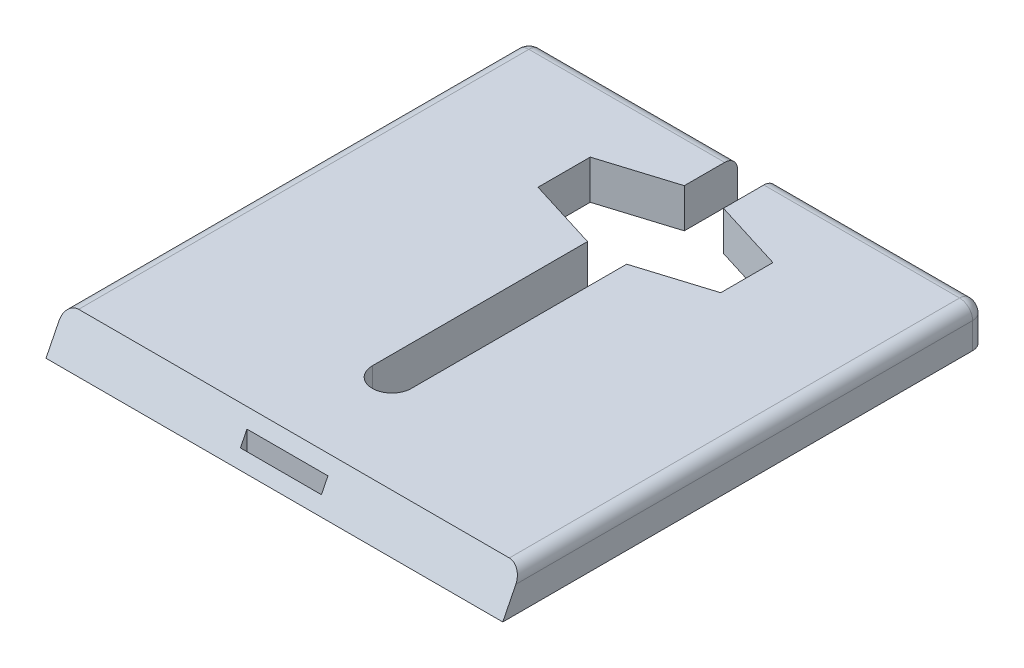
ISO-10303-21;
HEADER;
FILE_DESCRIPTION(('STEP AP214'),'2;1');
FILE_NAME('part.step','',(''),(''),'','','');
FILE_SCHEMA(('AUTOMOTIVE_DESIGN { 1 0 10303 214 1 1 1 1 }'));
ENDSEC;
DATA;
#1=APPLICATION_CONTEXT('core data for automotive mechanical design processes');
#2=APPLICATION_PROTOCOL_DEFINITION('international standard','automotive_design',2000,#1);
#3=PRODUCT_CONTEXT('',#1,'mechanical');
#4=PRODUCT('Part','Part','',(#3));
#5=PRODUCT_RELATED_PRODUCT_CATEGORY('part','',(#4));
#6=PRODUCT_DEFINITION_FORMATION('','',#4);
#7=PRODUCT_DEFINITION_CONTEXT('part definition',#1,'design');
#8=PRODUCT_DEFINITION('design','',#6,#7);
#9=PRODUCT_DEFINITION_SHAPE('','',#8);
#10=(LENGTH_UNIT() NAMED_UNIT(*) SI_UNIT(.MILLI.,.METRE.));
#11=(NAMED_UNIT(*) PLANE_ANGLE_UNIT() SI_UNIT($,.RADIAN.));
#12=(NAMED_UNIT(*) SI_UNIT($,.STERADIAN.) SOLID_ANGLE_UNIT());
#13=UNCERTAINTY_MEASURE_WITH_UNIT(LENGTH_MEASURE(1.E-05),#10,'distance_accuracy_value','');
#14=(GEOMETRIC_REPRESENTATION_CONTEXT(3) GLOBAL_UNCERTAINTY_ASSIGNED_CONTEXT((#13)) GLOBAL_UNIT_ASSIGNED_CONTEXT((#10,
#11,#12)) REPRESENTATION_CONTEXT('',''));
#15=CARTESIAN_POINT('',(0.,0.,0.));
#16=DIRECTION('',(0.,0.,1.));
#17=DIRECTION('',(1.,0.,0.));
#18=AXIS2_PLACEMENT_3D('',#15,#16,#17);
#19=CARTESIAN_POINT('',(-8.75,1.5,-9.25));
#20=DIRECTION('',(0.,0.,1.));
#21=DIRECTION('',(1.,0.,0.));
#22=AXIS2_PLACEMENT_3D('',#19,#20,#21);
#23=PLANE('',#22);
#24=DIRECTION('',(-1.,0.,0.));
#25=VECTOR('',#24,1.);
#26=CARTESIAN_POINT('',(-8.75,0.,-9.25));
#27=LINE('',#26,#25);
#28=CARTESIAN_POINT('',(8.25,0.,-9.25));
#29=VERTEX_POINT('',#28);
#30=CARTESIAN_POINT('',(0.75,0.,-9.25));
#31=VERTEX_POINT('',#30);
#32=EDGE_CURVE('E348',#29,#31,#27,.T.);
#33=ORIENTED_EDGE('',*,*,#32,.T.);
#34=DIRECTION('',(0.,1.,0.));
#35=VECTOR('',#34,1.);
#36=CARTESIAN_POINT('',(0.75,-15.5724115023974,-9.25));
#37=LINE('',#36,#35);
#38=CARTESIAN_POINT('',(0.75,0.999999999999999,-9.25));
#39=VERTEX_POINT('',#38);
#40=EDGE_CURVE('E233',#31,#39,#37,.T.);
#41=ORIENTED_EDGE('',*,*,#40,.T.);
#42=DIRECTION('',(-1.,0.,0.));
#43=VECTOR('',#42,1.);
#44=CARTESIAN_POINT('',(-8.75,1.,-9.25));
#45=LINE('',#44,#43);
#46=CARTESIAN_POINT('',(8.25,1.,-9.25));
#47=VERTEX_POINT('',#46);
#48=EDGE_CURVE('E373',#39,#47,#45,.F.);
#49=ORIENTED_EDGE('',*,*,#48,.T.);
#50=DIRECTION('',(0.,-1.,0.));
#51=VECTOR('',#50,1.);
#52=CARTESIAN_POINT('',(8.25,1.5,-9.25));
#53=LINE('',#52,#51);
#54=EDGE_CURVE('E403',#47,#29,#53,.T.);
#55=ORIENTED_EDGE('',*,*,#54,.T.);
#56=EDGE_LOOP('',(#33,#41,#49,#55));
#57=FACE_BOUND('',#56,.T.);
#58=ADVANCED_FACE('F40',(#57),#23,.F.);
#59=CARTESIAN_POINT('',(0.,1.,-8.75));
#60=DIRECTION('',(-1.,0.,0.));
#61=DIRECTION('',(0.,0.,1.));
#62=AXIS2_PLACEMENT_3D('',#59,#60,#61);
#63=CYLINDRICAL_SURFACE('',#62,0.5);
#64=CARTESIAN_POINT('',(-0.75,1.,-8.75));
#65=DIRECTION('',(-1.,0.,0.));
#66=DIRECTION('',(0.,0.,1.));
#67=AXIS2_PLACEMENT_3D('',#64,#65,#66);
#68=CIRCLE('',#67,0.5);
#69=CARTESIAN_POINT('',(-0.75,0.999999999999999,-9.25));
#70=VERTEX_POINT('',#69);
#71=CARTESIAN_POINT('',(-0.75,1.5,-8.75));
#72=VERTEX_POINT('',#71);
#73=EDGE_CURVE('E268',#70,#72,#68,.F.);
#74=ORIENTED_EDGE('',*,*,#73,.F.);
#75=CARTESIAN_POINT('',(-8.25,1.,-9.25));
#76=VERTEX_POINT('',#75);
#77=EDGE_CURVE('E374',#76,#70,#45,.F.);
#78=ORIENTED_EDGE('',*,*,#77,.F.);
#79=CARTESIAN_POINT('',(-8.25,1.,-8.75));
#80=DIRECTION('',(-1.,0.,0.));
#81=DIRECTION('',(0.,0.,1.));
#82=AXIS2_PLACEMENT_3D('',#79,#80,#81);
#83=CIRCLE('',#82,0.5);
#84=CARTESIAN_POINT('',(-8.25,1.5,-8.75));
#85=VERTEX_POINT('',#84);
#86=EDGE_CURVE('E389',#76,#85,#83,.F.);
#87=ORIENTED_EDGE('',*,*,#86,.T.);
#88=DIRECTION('',(-1.,0.,0.));
#89=VECTOR('',#88,1.);
#90=CARTESIAN_POINT('',(0.,1.5,-8.75));
#91=LINE('',#90,#89);
#92=EDGE_CURVE('E361',#72,#85,#91,.T.);
#93=ORIENTED_EDGE('',*,*,#92,.F.);
#94=EDGE_LOOP('',(#74,#78,#87,#93));
#95=FACE_BOUND('',#94,.T.);
#96=ADVANCED_FACE('F460',(#95),#63,.T.);
#97=CARTESIAN_POINT('',(8.75,1.5,9.25));
#98=DIRECTION('',(-1.,0.,0.));
#99=DIRECTION('',(0.,0.,1.));
#100=AXIS2_PLACEMENT_3D('',#97,#98,#99);
#101=PLANE('',#100);
#102=DIRECTION('',(0.,0.,-1.));
#103=VECTOR('',#102,1.);
#104=CARTESIAN_POINT('',(8.75,0.,9.25));
#105=LINE('',#104,#103);
#106=CARTESIAN_POINT('',(8.75,0.,9.25));
#107=VERTEX_POINT('',#106);
#108=CARTESIAN_POINT('',(8.75,0.,-8.75));
#109=VERTEX_POINT('',#108);
#110=EDGE_CURVE('E343',#107,#109,#105,.T.);
#111=ORIENTED_EDGE('',*,*,#110,.T.);
#112=DIRECTION('',(0.,-1.,0.));
#113=VECTOR('',#112,1.);
#114=CARTESIAN_POINT('',(8.75,1.5,-8.75));
#115=LINE('',#114,#113);
#116=CARTESIAN_POINT('',(8.75,1.,-8.75));
#117=VERTEX_POINT('',#116);
#118=EDGE_CURVE('E413',#109,#117,#115,.F.);
#119=ORIENTED_EDGE('',*,*,#118,.T.);
#120=DIRECTION('',(0.,0.,-1.));
#121=VECTOR('',#120,1.);
#122=CARTESIAN_POINT('',(8.75,1.,9.25));
#123=LINE('',#122,#121);
#124=CARTESIAN_POINT('',(8.75,1.,8.75));
#125=VERTEX_POINT('',#124);
#126=EDGE_CURVE('E370',#117,#125,#123,.F.);
#127=ORIENTED_EDGE('',*,*,#126,.T.);
#128=DIRECTION('',(0.,0.894427190999916,-0.447213595499958));
#129=VECTOR('',#128,1.);
#130=CARTESIAN_POINT('',(8.75,0.,9.25));
#131=LINE('',#130,#129);
#132=EDGE_CURVE('E328',#107,#125,#131,.T.);
#133=ORIENTED_EDGE('',*,*,#132,.F.);
#134=EDGE_LOOP('',(#111,#119,#127,#133));
#135=FACE_BOUND('',#134,.T.);
#136=ADVANCED_FACE('F467',(#135),#101,.F.);
#137=ORIENTED_EDGE('',*,*,#77,.T.);
#138=DIRECTION('',(0.,1.,0.));
#139=VECTOR('',#138,1.);
#140=CARTESIAN_POINT('',(-0.75,-15.5724115023974,-9.25));
#141=LINE('',#140,#139);
#142=CARTESIAN_POINT('',(-0.75,0.,-9.25));
#143=VERTEX_POINT('',#142);
#144=EDGE_CURVE('E252',#143,#70,#141,.T.);
#145=ORIENTED_EDGE('',*,*,#144,.F.);
#146=CARTESIAN_POINT('',(-8.25,0.,-9.25));
#147=VERTEX_POINT('',#146);
#148=EDGE_CURVE('E347',#143,#147,#27,.T.);
#149=ORIENTED_EDGE('',*,*,#148,.T.);
#150=DIRECTION('',(0.,-1.,0.));
#151=VECTOR('',#150,1.);
#152=CARTESIAN_POINT('',(-8.25,1.5,-9.25));
#153=LINE('',#152,#151);
#154=EDGE_CURVE('E400',#147,#76,#153,.F.);
#155=ORIENTED_EDGE('',*,*,#154,.T.);
#156=EDGE_LOOP('',(#137,#145,#149,#155));
#157=FACE_BOUND('',#156,.T.);
#158=ADVANCED_FACE('F463',(#157),#23,.F.);
#159=CARTESIAN_POINT('',(-8.75,1.5,9.25));
#160=DIRECTION('',(1.,0.,0.));
#161=DIRECTION('',(0.,0.,-1.));
#162=AXIS2_PLACEMENT_3D('',#159,#160,#161);
#163=PLANE('',#162);
#164=DIRECTION('',(0.,0.,1.));
#165=VECTOR('',#164,1.);
#166=CARTESIAN_POINT('',(-8.75,1.,9.25));
#167=LINE('',#166,#165);
#168=CARTESIAN_POINT('',(-8.75,1.,8.75));
#169=VERTEX_POINT('',#168);
#170=CARTESIAN_POINT('',(-8.75,1.,-8.75));
#171=VERTEX_POINT('',#170);
#172=EDGE_CURVE('E378',#169,#171,#167,.F.);
#173=ORIENTED_EDGE('',*,*,#172,.T.);
#174=DIRECTION('',(0.,-1.,0.));
#175=VECTOR('',#174,1.);
#176=CARTESIAN_POINT('',(-8.75,1.5,-8.75));
#177=LINE('',#176,#175);
#178=CARTESIAN_POINT('',(-8.75,0.,-8.75));
#179=VERTEX_POINT('',#178);
#180=EDGE_CURVE('E416',#171,#179,#177,.T.);
#181=ORIENTED_EDGE('',*,*,#180,.T.);
#182=DIRECTION('',(0.,0.,1.));
#183=VECTOR('',#182,1.);
#184=CARTESIAN_POINT('',(-8.75,0.,9.25));
#185=LINE('',#184,#183);
#186=CARTESIAN_POINT('',(-8.75,0.,9.25));
#187=VERTEX_POINT('',#186);
#188=EDGE_CURVE('E351',#179,#187,#185,.T.);
#189=ORIENTED_EDGE('',*,*,#188,.T.);
#190=DIRECTION('',(0.,-0.894427190999916,0.447213595499958));
#191=VECTOR('',#190,1.);
#192=CARTESIAN_POINT('',(-8.75,0.,9.25));
#193=LINE('',#192,#191);
#194=EDGE_CURVE('E334',#169,#187,#193,.T.);
#195=ORIENTED_EDGE('',*,*,#194,.F.);
#196=EDGE_LOOP('',(#173,#181,#189,#195));
#197=FACE_BOUND('',#196,.T.);
#198=ADVANCED_FACE('F474',(#197),#163,.F.);
#199=CARTESIAN_POINT('',(0.,1.5,0.));
#200=DIRECTION('',(0.,-1.,0.));
#201=DIRECTION('',(0.,0.,-1.));
#202=AXIS2_PLACEMENT_3D('',#199,#200,#201);
#203=PLANE('',#202);
#204=DIRECTION('',(0.,0.,-1.));
#205=VECTOR('',#204,1.);
#206=CARTESIAN_POINT('',(0.75,1.5,-9.25));
#207=LINE('',#206,#205);
#208=CARTESIAN_POINT('',(0.75,1.5,-7.20404962177391));
#209=VERTEX_POINT('',#208);
#210=CARTESIAN_POINT('',(0.75,1.5,-8.75));
#211=VERTEX_POINT('',#210);
#212=EDGE_CURVE('E527',#209,#211,#207,.T.);
#213=ORIENTED_EDGE('',*,*,#212,.F.);
#214=DIRECTION('',(-0.955005001561926,0.,-0.29658969468224));
#215=VECTOR('',#214,1.);
#216=CARTESIAN_POINT('',(0.75,1.5,-7.20404962177391));
#217=LINE('',#216,#215);
#218=CARTESIAN_POINT('',(3.5,1.5,-6.35));
#219=VERTEX_POINT('',#218);
#220=EDGE_CURVE('E210',#219,#209,#217,.T.);
#221=ORIENTED_EDGE('',*,*,#220,.F.);
#222=DIRECTION('',(0.,0.,-1.));
#223=VECTOR('',#222,1.);
#224=CARTESIAN_POINT('',(3.5,1.5,0.));
#225=LINE('',#224,#223);
#226=CARTESIAN_POINT('',(3.5,1.5,-4.35));
#227=VERTEX_POINT('',#226);
#228=EDGE_CURVE('E306',#227,#219,#225,.T.);
#229=ORIENTED_EDGE('',*,*,#228,.F.);
#230=DIRECTION('',(0.955005001561926,0.,-0.296589694682241));
#231=VECTOR('',#230,1.);
#232=CARTESIAN_POINT('',(3.5,1.5,-4.35));
#233=LINE('',#232,#231);
#234=CARTESIAN_POINT('',(0.750000000000001,1.5,-3.49595037822608));
#235=VERTEX_POINT('',#234);
#236=EDGE_CURVE('E229',#235,#227,#233,.T.);
#237=ORIENTED_EDGE('',*,*,#236,.F.);
#238=CARTESIAN_POINT('',(0.750000000000002,1.5,4.75));
#239=VERTEX_POINT('',#238);
#240=EDGE_CURVE('E540',#239,#235,#207,.T.);
#241=ORIENTED_EDGE('',*,*,#240,.F.);
#242=CARTESIAN_POINT('',(0.,1.5,4.75));
#243=DIRECTION('',(0.,1.,0.));
#244=DIRECTION('',(0.,0.,1.));
#245=AXIS2_PLACEMENT_3D('',#242,#243,#244);
#246=CIRCLE('',#245,0.75);
#247=CARTESIAN_POINT('',(-0.749999999999998,1.5,4.75));
#248=VERTEX_POINT('',#247);
#249=EDGE_CURVE('E550',#248,#239,#246,.T.);
#250=ORIENTED_EDGE('',*,*,#249,.F.);
#251=DIRECTION('',(0.,0.,1.));
#252=VECTOR('',#251,1.);
#253=CARTESIAN_POINT('',(-0.75,1.5,-9.25));
#254=LINE('',#253,#252);
#255=CARTESIAN_POINT('',(-0.749999999999999,1.5,-3.49595037822608));
#256=VERTEX_POINT('',#255);
#257=EDGE_CURVE('E557',#256,#248,#254,.T.);
#258=ORIENTED_EDGE('',*,*,#257,.F.);
#259=DIRECTION('',(0.955005001561927,0.,0.29658969468224));
#260=VECTOR('',#259,1.);
#261=CARTESIAN_POINT('',(-0.749999999999999,1.5,-3.49595037822608));
#262=LINE('',#261,#260);
#263=CARTESIAN_POINT('',(-3.5,1.5,-4.35));
#264=VERTEX_POINT('',#263);
#265=EDGE_CURVE('E576',#264,#256,#262,.T.);
#266=ORIENTED_EDGE('',*,*,#265,.F.);
#267=DIRECTION('',(0.,0.,-1.));
#268=VECTOR('',#267,1.);
#269=CARTESIAN_POINT('',(-3.5,1.5,0.));
#270=LINE('',#269,#268);
#271=CARTESIAN_POINT('',(-3.5,1.5,-6.35));
#272=VERTEX_POINT('',#271);
#273=EDGE_CURVE('E300',#264,#272,#270,.T.);
#274=ORIENTED_EDGE('',*,*,#273,.T.);
#275=DIRECTION('',(-0.955005001561927,0.,0.296589694682241));
#276=VECTOR('',#275,1.);
#277=CARTESIAN_POINT('',(-3.5,1.5,-6.35));
#278=LINE('',#277,#276);
#279=CARTESIAN_POINT('',(-0.75,1.5,-7.20404962177391));
#280=VERTEX_POINT('',#279);
#281=EDGE_CURVE('E573',#280,#272,#278,.T.);
#282=ORIENTED_EDGE('',*,*,#281,.F.);
#283=EDGE_CURVE('E556',#72,#280,#254,.T.);
#284=ORIENTED_EDGE('',*,*,#283,.F.);
#285=ORIENTED_EDGE('',*,*,#92,.T.);
#286=DIRECTION('',(0.,0.,1.));
#287=VECTOR('',#286,1.);
#288=CARTESIAN_POINT('',(-8.25,1.5,0.));
#289=LINE('',#288,#287);
#290=CARTESIAN_POINT('',(-8.25,1.5,8.5));
#291=VERTEX_POINT('',#290);
#292=EDGE_CURVE('E357',#85,#291,#289,.T.);
#293=ORIENTED_EDGE('',*,*,#292,.T.);
#294=DIRECTION('',(-1.,0.,0.));
#295=VECTOR('',#294,1.);
#296=CARTESIAN_POINT('',(10.4270509831248,1.5,8.5));
#297=LINE('',#296,#295);
#298=CARTESIAN_POINT('',(8.25,1.5,8.5));
#299=VERTEX_POINT('',#298);
#300=EDGE_CURVE('E333',#299,#291,#297,.T.);
#301=ORIENTED_EDGE('',*,*,#300,.F.);
#302=DIRECTION('',(0.,0.,-1.));
#303=VECTOR('',#302,1.);
#304=CARTESIAN_POINT('',(8.25,1.5,0.));
#305=LINE('',#304,#303);
#306=CARTESIAN_POINT('',(8.25,1.5,-8.75));
#307=VERTEX_POINT('',#306);
#308=EDGE_CURVE('E366',#299,#307,#305,.T.);
#309=ORIENTED_EDGE('',*,*,#308,.T.);
#310=EDGE_CURVE('E362',#307,#211,#91,.T.);
#311=ORIENTED_EDGE('',*,*,#310,.T.);
#312=EDGE_LOOP('',(#213,#221,#229,#237,#241,#250,#258,#266,#274,#282,#284,#285,#293,#301,#309,#311));
#313=FACE_BOUND('',#312,.T.);
#314=ADVANCED_FACE('F480',(#313),#203,.F.);
#315=CARTESIAN_POINT('',(0.,0.,0.));
#316=DIRECTION('',(0.,-1.,0.));
#317=DIRECTION('',(0.,0.,-1.));
#318=AXIS2_PLACEMENT_3D('',#315,#316,#317);
#319=PLANE('',#318);
#320=DIRECTION('',(-0.955005001561927,0.,-0.29658969468224));
#321=VECTOR('',#320,1.);
#322=CARTESIAN_POINT('',(0.75,0.,-7.20404962177391));
#323=LINE('',#322,#321);
#324=CARTESIAN_POINT('',(3.5,0.,-6.35));
#325=VERTEX_POINT('',#324);
#326=CARTESIAN_POINT('',(0.75,0.,-7.20404962177391));
#327=VERTEX_POINT('',#326);
#328=EDGE_CURVE('E207',#325,#327,#323,.T.);
#329=ORIENTED_EDGE('',*,*,#328,.T.);
#330=DIRECTION('',(0.,0.,-1.));
#331=VECTOR('',#330,1.);
#332=CARTESIAN_POINT('',(0.75,0.,-9.25));
#333=LINE('',#332,#331);
#334=EDGE_CURVE('E222',#327,#31,#333,.T.);
#335=ORIENTED_EDGE('',*,*,#334,.T.);
#336=ORIENTED_EDGE('',*,*,#32,.F.);
#337=CARTESIAN_POINT('',(8.25,0.,-8.75));
#338=DIRECTION('',(0.,-1.,0.));
#339=DIRECTION('',(0.,0.,-1.));
#340=AXIS2_PLACEMENT_3D('',#337,#338,#339);
#341=CIRCLE('',#340,0.5);
#342=EDGE_CURVE('E410',#29,#109,#341,.T.);
#343=ORIENTED_EDGE('',*,*,#342,.T.);
#344=ORIENTED_EDGE('',*,*,#110,.F.);
#345=DIRECTION('',(1.,0.,0.));
#346=VECTOR('',#345,1.);
#347=CARTESIAN_POINT('',(-8.75,0.,9.25));
#348=LINE('',#347,#346);
#349=EDGE_CURVE('E354',#187,#107,#348,.T.);
#350=ORIENTED_EDGE('',*,*,#349,.F.);
#351=ORIENTED_EDGE('',*,*,#188,.F.);
#352=CARTESIAN_POINT('',(-8.25,0.,-8.75));
#353=DIRECTION('',(0.,-1.,0.));
#354=DIRECTION('',(0.,0.,-1.));
#355=AXIS2_PLACEMENT_3D('',#352,#353,#354);
#356=CIRCLE('',#355,0.5);
#357=EDGE_CURVE('E406',#179,#147,#356,.T.);
#358=ORIENTED_EDGE('',*,*,#357,.T.);
#359=ORIENTED_EDGE('',*,*,#148,.F.);
#360=DIRECTION('',(0.,0.,1.));
#361=VECTOR('',#360,1.);
#362=CARTESIAN_POINT('',(-0.75,0.,-9.25));
#363=LINE('',#362,#361);
#364=CARTESIAN_POINT('',(-0.75,0.,-7.20404962177391));
#365=VERTEX_POINT('',#364);
#366=EDGE_CURVE('E245',#143,#365,#363,.T.);
#367=ORIENTED_EDGE('',*,*,#366,.T.);
#368=DIRECTION('',(-0.955005001561927,0.,0.29658969468224));
#369=VECTOR('',#368,1.);
#370=CARTESIAN_POINT('',(-3.5,0.,-6.35));
#371=LINE('',#370,#369);
#372=CARTESIAN_POINT('',(-3.5,0.,-6.35));
#373=VERTEX_POINT('',#372);
#374=EDGE_CURVE('E228',#365,#373,#371,.T.);
#375=ORIENTED_EDGE('',*,*,#374,.T.);
#376=DIRECTION('',(0.,0.,-1.));
#377=VECTOR('',#376,1.);
#378=CARTESIAN_POINT('',(-3.5,0.,0.));
#379=LINE('',#378,#377);
#380=CARTESIAN_POINT('',(-3.5,0.,-4.35));
#381=VERTEX_POINT('',#380);
#382=EDGE_CURVE('E299',#381,#373,#379,.T.);
#383=ORIENTED_EDGE('',*,*,#382,.F.);
#384=DIRECTION('',(0.955005001561927,0.,0.29658969468224));
#385=VECTOR('',#384,1.);
#386=CARTESIAN_POINT('',(-0.749999999999999,0.,-3.49595037822608));
#387=LINE('',#386,#385);
#388=CARTESIAN_POINT('',(-0.749999999999999,0.,-3.49595037822608));
#389=VERTEX_POINT('',#388);
#390=EDGE_CURVE('E567',#381,#389,#387,.T.);
#391=ORIENTED_EDGE('',*,*,#390,.T.);
#392=CARTESIAN_POINT('',(-0.749999999999998,0.,4.75));
#393=VERTEX_POINT('',#392);
#394=EDGE_CURVE('E537',#389,#393,#363,.T.);
#395=ORIENTED_EDGE('',*,*,#394,.T.);
#396=CARTESIAN_POINT('',(0.,0.,4.75));
#397=DIRECTION('',(0.,-1.,0.));
#398=DIRECTION('',(0.,0.,-1.));
#399=AXIS2_PLACEMENT_3D('',#396,#397,#398);
#400=CIRCLE('',#399,0.75);
#401=CARTESIAN_POINT('',(0.750000000000002,0.,4.75));
#402=VERTEX_POINT('',#401);
#403=EDGE_CURVE('E241',#393,#402,#400,.F.);
#404=ORIENTED_EDGE('',*,*,#403,.T.);
#405=CARTESIAN_POINT('',(0.750000000000001,0.,-3.49595037822608));
#406=VERTEX_POINT('',#405);
#407=EDGE_CURVE('E235',#402,#406,#333,.T.);
#408=ORIENTED_EDGE('',*,*,#407,.T.);
#409=DIRECTION('',(0.955005001561927,0.,-0.296589694682241));
#410=VECTOR('',#409,1.);
#411=CARTESIAN_POINT('',(3.5,0.,-4.35));
#412=LINE('',#411,#410);
#413=CARTESIAN_POINT('',(3.5,0.,-4.35));
#414=VERTEX_POINT('',#413);
#415=EDGE_CURVE('E559',#406,#414,#412,.T.);
#416=ORIENTED_EDGE('',*,*,#415,.T.);
#417=DIRECTION('',(0.,0.,-1.));
#418=VECTOR('',#417,1.);
#419=CARTESIAN_POINT('',(3.5,0.,0.));
#420=LINE('',#419,#418);
#421=EDGE_CURVE('E226',#414,#325,#420,.T.);
#422=ORIENTED_EDGE('',*,*,#421,.T.);
#423=EDGE_LOOP('',(#329,#335,#336,#343,#344,#350,#351,#358,#359,#367,#375,#383,#391,#395,#404,
#408,#416,#422));
#424=FACE_BOUND('',#423,.T.);
#425=DIRECTION('',(-1.,0.,0.));
#426=VECTOR('',#425,1.);
#427=CARTESIAN_POINT('',(-1.55150408909738,0.,8.75));
#428=LINE('',#427,#426);
#429=CARTESIAN_POINT('',(1.55150408909743,0.,8.75));
#430=VERTEX_POINT('',#429);
#431=CARTESIAN_POINT('',(-1.55150408909738,0.,8.75));
#432=VERTEX_POINT('',#431);
#433=EDGE_CURVE('E271',#430,#432,#428,.T.);
#434=ORIENTED_EDGE('',*,*,#433,.T.);
#435=DIRECTION('',(0.,0.,1.));
#436=VECTOR('',#435,1.);
#437=CARTESIAN_POINT('',(-1.55150408909738,0.,9.));
#438=LINE('',#437,#436);
#439=CARTESIAN_POINT('',(-1.55150408909738,0.,9.));
#440=VERTEX_POINT('',#439);
#441=EDGE_CURVE('E285',#432,#440,#438,.T.);
#442=ORIENTED_EDGE('',*,*,#441,.T.);
#443=DIRECTION('',(1.,0.,0.));
#444=VECTOR('',#443,1.);
#445=CARTESIAN_POINT('',(-1.55150408909738,0.,9.));
#446=LINE('',#445,#444);
#447=CARTESIAN_POINT('',(1.55150408909743,0.,9.));
#448=VERTEX_POINT('',#447);
#449=EDGE_CURVE('E280',#440,#448,#446,.T.);
#450=ORIENTED_EDGE('',*,*,#449,.T.);
#451=DIRECTION('',(0.,0.,-1.));
#452=VECTOR('',#451,1.);
#453=CARTESIAN_POINT('',(1.55150408909743,0.,9.));
#454=LINE('',#453,#452);
#455=EDGE_CURVE('E276',#448,#430,#454,.T.);
#456=ORIENTED_EDGE('',*,*,#455,.T.);
#457=EDGE_LOOP('',(#434,#442,#450,#456));
#458=FACE_BOUND('',#457,.T.);
#459=ADVANCED_FACE('F219',(#424,#458),#319,.T.);
#460=CARTESIAN_POINT('',(-8.25,1.,0.));
#461=DIRECTION('',(0.,0.,1.));
#462=DIRECTION('',(1.,0.,0.));
#463=AXIS2_PLACEMENT_3D('',#460,#461,#462);
#464=CYLINDRICAL_SURFACE('',#463,0.5);
#465=ORIENTED_EDGE('',*,*,#292,.F.);
#466=CARTESIAN_POINT('',(-8.25,1.,-8.75));
#467=DIRECTION('',(0.,0.,1.));
#468=DIRECTION('',(1.,0.,0.));
#469=AXIS2_PLACEMENT_3D('',#466,#467,#468);
#470=CIRCLE('',#469,0.5);
#471=EDGE_CURVE('E397',#85,#171,#470,.T.);
#472=ORIENTED_EDGE('',*,*,#471,.T.);
#473=ORIENTED_EDGE('',*,*,#172,.F.);
#474=CARTESIAN_POINT('',(-8.25,1.,8.75));
#475=DIRECTION('',(0.,-0.447213595499958,-0.894427190999916));
#476=DIRECTION('',(0.,-0.894427190999916,0.447213595499958));
#477=AXIS2_PLACEMENT_3D('',#474,#475,#476);
#478=ELLIPSE('',#477,0.559016994374947,0.5);
#479=EDGE_CURVE('E332',#291,#169,#478,.F.);
#480=ORIENTED_EDGE('',*,*,#479,.F.);
#481=EDGE_LOOP('',(#465,#472,#473,#480));
#482=FACE_BOUND('',#481,.T.);
#483=ADVANCED_FACE('F500',(#482),#464,.T.);
#484=CARTESIAN_POINT('',(0.75,1.,-8.75));
#485=DIRECTION('',(1.,0.,0.));
#486=DIRECTION('',(0.,0.,-1.));
#487=AXIS2_PLACEMENT_3D('',#484,#485,#486);
#488=CIRCLE('',#487,0.5);
#489=EDGE_CURVE('E262',#211,#39,#488,.F.);
#490=ORIENTED_EDGE('',*,*,#489,.F.);
#491=ORIENTED_EDGE('',*,*,#310,.F.);
#492=CARTESIAN_POINT('',(8.25,1.,-8.75));
#493=DIRECTION('',(-1.,0.,0.));
#494=DIRECTION('',(0.,0.,1.));
#495=AXIS2_PLACEMENT_3D('',#492,#493,#494);
#496=CIRCLE('',#495,0.5);
#497=EDGE_CURVE('E393',#307,#47,#496,.T.);
#498=ORIENTED_EDGE('',*,*,#497,.T.);
#499=ORIENTED_EDGE('',*,*,#48,.F.);
#500=EDGE_LOOP('',(#490,#491,#498,#499));
#501=FACE_BOUND('',#500,.T.);
#502=ADVANCED_FACE('F470',(#501),#63,.T.);
#503=CARTESIAN_POINT('',(8.25,1.,0.));
#504=DIRECTION('',(0.,0.,-1.));
#505=DIRECTION('',(-1.,0.,0.));
#506=AXIS2_PLACEMENT_3D('',#503,#504,#505);
#507=CYLINDRICAL_SURFACE('',#506,0.5);
#508=ORIENTED_EDGE('',*,*,#126,.F.);
#509=CARTESIAN_POINT('',(8.25,1.,-8.75));
#510=DIRECTION('',(0.,0.,-1.));
#511=DIRECTION('',(-1.,0.,0.));
#512=AXIS2_PLACEMENT_3D('',#509,#510,#511);
#513=CIRCLE('',#512,0.5);
#514=EDGE_CURVE('E385',#117,#307,#513,.F.);
#515=ORIENTED_EDGE('',*,*,#514,.T.);
#516=ORIENTED_EDGE('',*,*,#308,.F.);
#517=CARTESIAN_POINT('',(8.25,1.,8.75));
#518=DIRECTION('',(0.,-0.447213595499958,-0.894427190999916));
#519=DIRECTION('',(0.,0.894427190999916,-0.447213595499958));
#520=AXIS2_PLACEMENT_3D('',#517,#518,#519);
#521=ELLIPSE('',#520,0.559016994374947,0.5);
#522=EDGE_CURVE('E382',#125,#299,#521,.F.);
#523=ORIENTED_EDGE('',*,*,#522,.F.);
#524=EDGE_LOOP('',(#508,#515,#516,#523));
#525=FACE_BOUND('',#524,.T.);
#526=ADVANCED_FACE('F519',(#525),#507,.T.);
#527=CARTESIAN_POINT('',(10.4270509831248,0.,9.25));
#528=DIRECTION('',(0.,-0.447213595499958,-0.894427190999916));
#529=DIRECTION('',(0.,0.894427190999916,-0.447213595499958));
#530=AXIS2_PLACEMENT_3D('',#527,#528,#529);
#531=PLANE('',#530);
#532=DIRECTION('',(0.,0.894427190999916,-0.447213595499958));
#533=VECTOR('',#532,1.);
#534=CARTESIAN_POINT('',(-1.55150408909738,0.,9.25));
#535=LINE('',#534,#533);
#536=CARTESIAN_POINT('',(-1.55150408909738,0.5,9.));
#537=VERTEX_POINT('',#536);
#538=CARTESIAN_POINT('',(-1.55150408909738,0.999999999999997,8.75));
#539=VERTEX_POINT('',#538);
#540=EDGE_CURVE('E433',#537,#539,#535,.T.);
#541=ORIENTED_EDGE('',*,*,#540,.T.);
#542=DIRECTION('',(1.,0.,0.));
#543=VECTOR('',#542,1.);
#544=CARTESIAN_POINT('',(10.4270509831248,1.,8.75));
#545=LINE('',#544,#543);
#546=CARTESIAN_POINT('',(1.55150408909743,0.999999999999997,8.75));
#547=VERTEX_POINT('',#546);
#548=EDGE_CURVE('E215',#539,#547,#545,.T.);
#549=ORIENTED_EDGE('',*,*,#548,.T.);
#550=DIRECTION('',(0.,-0.894427190999916,0.447213595499958));
#551=VECTOR('',#550,1.);
#552=CARTESIAN_POINT('',(1.55150408909743,0.,9.25));
#553=LINE('',#552,#551);
#554=CARTESIAN_POINT('',(1.55150408909743,0.500000000000001,9.));
#555=VERTEX_POINT('',#554);
#556=EDGE_CURVE('E419',#547,#555,#553,.T.);
#557=ORIENTED_EDGE('',*,*,#556,.T.);
#558=DIRECTION('',(-1.,0.,0.));
#559=VECTOR('',#558,1.);
#560=CARTESIAN_POINT('',(10.4270509831248,0.5,9.));
#561=LINE('',#560,#559);
#562=EDGE_CURVE('E429',#555,#537,#561,.T.);
#563=ORIENTED_EDGE('',*,*,#562,.T.);
#564=EDGE_LOOP('',(#541,#549,#557,#563));
#565=FACE_BOUND('',#564,.T.);
#566=ORIENTED_EDGE('',*,*,#479,.T.);
#567=ORIENTED_EDGE('',*,*,#194,.T.);
#568=ORIENTED_EDGE('',*,*,#349,.T.);
#569=ORIENTED_EDGE('',*,*,#132,.T.);
#570=ORIENTED_EDGE('',*,*,#522,.T.);
#571=ORIENTED_EDGE('',*,*,#300,.T.);
#572=EDGE_LOOP('',(#566,#567,#568,#569,#570,#571));
#573=FACE_BOUND('',#572,.T.);
#574=ADVANCED_FACE('F440',(#565,#573),#531,.F.);
#575=CARTESIAN_POINT('',(8.25,1.5,-8.75));
#576=DIRECTION('',(0.,-1.,0.));
#577=DIRECTION('',(0.,0.,-1.));
#578=AXIS2_PLACEMENT_3D('',#575,#576,#577);
#579=CYLINDRICAL_SURFACE('',#578,0.5);
#580=ORIENTED_EDGE('',*,*,#342,.F.);
#581=ORIENTED_EDGE('',*,*,#54,.F.);
#582=CARTESIAN_POINT('',(8.25,1.,-8.75));
#583=DIRECTION('',(0.,1.,0.));
#584=DIRECTION('',(0.,0.,1.));
#585=AXIS2_PLACEMENT_3D('',#582,#583,#584);
#586=CIRCLE('',#585,0.5);
#587=EDGE_CURVE('E338',#117,#47,#586,.T.);
#588=ORIENTED_EDGE('',*,*,#587,.F.);
#589=ORIENTED_EDGE('',*,*,#118,.F.);
#590=EDGE_LOOP('',(#580,#581,#588,#589));
#591=FACE_BOUND('',#590,.T.);
#592=ADVANCED_FACE('F512',(#591),#579,.T.);
#593=CARTESIAN_POINT('',(8.25,1.,-8.75));
#594=DIRECTION('',(0.,0.,1.));
#595=DIRECTION('',(1.,0.,0.));
#596=AXIS2_PLACEMENT_3D('',#593,#594,#595);
#597=SPHERICAL_SURFACE('',#596,0.5);
#598=ORIENTED_EDGE('',*,*,#587,.T.);
#599=ORIENTED_EDGE('',*,*,#497,.F.);
#600=ORIENTED_EDGE('',*,*,#514,.F.);
#601=EDGE_LOOP('',(#598,#599,#600));
#602=FACE_BOUND('',#601,.T.);
#603=ADVANCED_FACE('F516',(#602),#597,.T.);
#604=CARTESIAN_POINT('',(-8.25,1.5,-8.75));
#605=DIRECTION('',(0.,-1.,0.));
#606=DIRECTION('',(0.,0.,-1.));
#607=AXIS2_PLACEMENT_3D('',#604,#605,#606);
#608=CYLINDRICAL_SURFACE('',#607,0.5);
#609=ORIENTED_EDGE('',*,*,#357,.F.);
#610=ORIENTED_EDGE('',*,*,#180,.F.);
#611=CARTESIAN_POINT('',(-8.25,1.,-8.75));
#612=DIRECTION('',(0.,1.,0.));
#613=DIRECTION('',(0.,0.,1.));
#614=AXIS2_PLACEMENT_3D('',#611,#612,#613);
#615=CIRCLE('',#614,0.5);
#616=EDGE_CURVE('E304',#76,#171,#615,.T.);
#617=ORIENTED_EDGE('',*,*,#616,.F.);
#618=ORIENTED_EDGE('',*,*,#154,.F.);
#619=EDGE_LOOP('',(#609,#610,#617,#618));
#620=FACE_BOUND('',#619,.T.);
#621=ADVANCED_FACE('F42',(#620),#608,.T.);
#622=CARTESIAN_POINT('',(-8.25,1.,-8.75));
#623=DIRECTION('',(0.,0.,1.));
#624=DIRECTION('',(1.,0.,0.));
#625=AXIS2_PLACEMENT_3D('',#622,#623,#624);
#626=SPHERICAL_SURFACE('',#625,0.5);
#627=ORIENTED_EDGE('',*,*,#616,.T.);
#628=ORIENTED_EDGE('',*,*,#471,.F.);
#629=ORIENTED_EDGE('',*,*,#86,.F.);
#630=EDGE_LOOP('',(#627,#628,#629));
#631=FACE_BOUND('',#630,.T.);
#632=ADVANCED_FACE('F497',(#631),#626,.T.);
#633=CARTESIAN_POINT('',(3.5,-8.06225774829855,0.));
#634=DIRECTION('',(1.,0.,0.));
#635=DIRECTION('',(0.,0.,-1.));
#636=AXIS2_PLACEMENT_3D('',#633,#634,#635);
#637=PLANE('',#636);
#638=DIRECTION('',(0.,1.,0.));
#639=VECTOR('',#638,1.);
#640=CARTESIAN_POINT('',(3.5,-8.06225774829855,-4.35));
#641=LINE('',#640,#639);
#642=EDGE_CURVE('E310',#414,#227,#641,.T.);
#643=ORIENTED_EDGE('',*,*,#642,.T.);
#644=ORIENTED_EDGE('',*,*,#228,.T.);
#645=DIRECTION('',(0.,1.,0.));
#646=VECTOR('',#645,1.);
#647=CARTESIAN_POINT('',(3.5,-8.06225774829855,-6.35));
#648=LINE('',#647,#646);
#649=EDGE_CURVE('E316',#325,#219,#648,.T.);
#650=ORIENTED_EDGE('',*,*,#649,.F.);
#651=ORIENTED_EDGE('',*,*,#421,.F.);
#652=EDGE_LOOP('',(#643,#644,#650,#651));
#653=FACE_BOUND('',#652,.T.);
#654=ADVANCED_FACE('F585',(#653),#637,.F.);
#655=CARTESIAN_POINT('',(-3.5,-8.06225774829855,0.));
#656=DIRECTION('',(1.,0.,0.));
#657=DIRECTION('',(0.,0.,-1.));
#658=AXIS2_PLACEMENT_3D('',#655,#656,#657);
#659=PLANE('',#658);
#660=ORIENTED_EDGE('',*,*,#382,.T.);
#661=DIRECTION('',(0.,1.,0.));
#662=VECTOR('',#661,1.);
#663=CARTESIAN_POINT('',(-3.5,-8.06225774829855,-6.35));
#664=LINE('',#663,#662);
#665=EDGE_CURVE('E319',#373,#272,#664,.T.);
#666=ORIENTED_EDGE('',*,*,#665,.T.);
#667=ORIENTED_EDGE('',*,*,#273,.F.);
#668=DIRECTION('',(0.,1.,0.));
#669=VECTOR('',#668,1.);
#670=CARTESIAN_POINT('',(-3.5,-8.06225774829855,-4.35));
#671=LINE('',#670,#669);
#672=EDGE_CURVE('E305',#381,#264,#671,.T.);
#673=ORIENTED_EDGE('',*,*,#672,.F.);
#674=EDGE_LOOP('',(#660,#666,#667,#673));
#675=FACE_BOUND('',#674,.T.);
#676=ADVANCED_FACE('F587',(#675),#659,.T.);
#677=CARTESIAN_POINT('',(-1.55150408909738,-3.11306276100304,8.75));
#678=DIRECTION('',(0.,0.,-1.));
#679=DIRECTION('',(-1.,0.,0.));
#680=AXIS2_PLACEMENT_3D('',#677,#678,#679);
#681=PLANE('',#680);
#682=DIRECTION('',(0.,1.,0.));
#683=VECTOR('',#682,1.);
#684=CARTESIAN_POINT('',(-1.55150408909738,-3.11306276100304,8.75));
#685=LINE('',#684,#683);
#686=EDGE_CURVE('E275',#432,#539,#685,.T.);
#687=ORIENTED_EDGE('',*,*,#686,.F.);
#688=ORIENTED_EDGE('',*,*,#433,.F.);
#689=DIRECTION('',(0.,1.,0.));
#690=VECTOR('',#689,1.);
#691=CARTESIAN_POINT('',(1.55150408909743,-3.11306276100304,8.75));
#692=LINE('',#691,#690);
#693=EDGE_CURVE('E56',#430,#547,#692,.T.);
#694=ORIENTED_EDGE('',*,*,#693,.T.);
#695=ORIENTED_EDGE('',*,*,#548,.F.);
#696=EDGE_LOOP('',(#687,#688,#694,#695));
#697=FACE_BOUND('',#696,.T.);
#698=ADVANCED_FACE('F444',(#697),#681,.F.);
#699=CARTESIAN_POINT('',(-1.55150408909738,-3.11306276100304,9.));
#700=DIRECTION('',(-1.,0.,0.));
#701=DIRECTION('',(0.,0.,1.));
#702=AXIS2_PLACEMENT_3D('',#699,#700,#701);
#703=PLANE('',#702);
#704=DIRECTION('',(0.,1.,0.));
#705=VECTOR('',#704,1.);
#706=CARTESIAN_POINT('',(-1.55150408909738,-3.11306276100304,9.));
#707=LINE('',#706,#705);
#708=EDGE_CURVE('E284',#440,#537,#707,.T.);
#709=ORIENTED_EDGE('',*,*,#708,.F.);
#710=ORIENTED_EDGE('',*,*,#441,.F.);
#711=ORIENTED_EDGE('',*,*,#686,.T.);
#712=ORIENTED_EDGE('',*,*,#540,.F.);
#713=EDGE_LOOP('',(#709,#710,#711,#712));
#714=FACE_BOUND('',#713,.T.);
#715=ADVANCED_FACE('F447',(#714),#703,.F.);
#716=CARTESIAN_POINT('',(-1.55150408909738,-3.11306276100304,9.));
#717=DIRECTION('',(0.,0.,1.));
#718=DIRECTION('',(1.,0.,0.));
#719=AXIS2_PLACEMENT_3D('',#716,#717,#718);
#720=PLANE('',#719);
#721=DIRECTION('',(0.,1.,0.));
#722=VECTOR('',#721,1.);
#723=CARTESIAN_POINT('',(1.55150408909743,-3.11306276100304,9.));
#724=LINE('',#723,#722);
#725=EDGE_CURVE('E61',#448,#555,#724,.T.);
#726=ORIENTED_EDGE('',*,*,#725,.F.);
#727=ORIENTED_EDGE('',*,*,#449,.F.);
#728=ORIENTED_EDGE('',*,*,#708,.T.);
#729=ORIENTED_EDGE('',*,*,#562,.F.);
#730=EDGE_LOOP('',(#726,#727,#728,#729));
#731=FACE_BOUND('',#730,.T.);
#732=ADVANCED_FACE('F450',(#731),#720,.F.);
#733=CARTESIAN_POINT('',(1.55150408909743,-3.11306276100304,9.));
#734=DIRECTION('',(1.,0.,0.));
#735=DIRECTION('',(0.,0.,-1.));
#736=AXIS2_PLACEMENT_3D('',#733,#734,#735);
#737=PLANE('',#736);
#738=ORIENTED_EDGE('',*,*,#693,.F.);
#739=ORIENTED_EDGE('',*,*,#455,.F.);
#740=ORIENTED_EDGE('',*,*,#725,.T.);
#741=ORIENTED_EDGE('',*,*,#556,.F.);
#742=EDGE_LOOP('',(#738,#739,#740,#741));
#743=FACE_BOUND('',#742,.T.);
#744=ADVANCED_FACE('F448',(#743),#737,.F.);
#745=CARTESIAN_POINT('',(0.75,-15.5724115023974,-9.25));
#746=DIRECTION('',(1.,0.,0.));
#747=DIRECTION('',(0.,0.,-1.));
#748=AXIS2_PLACEMENT_3D('',#745,#746,#747);
#749=PLANE('',#748);
#750=ORIENTED_EDGE('',*,*,#489,.T.);
#751=ORIENTED_EDGE('',*,*,#40,.F.);
#752=ORIENTED_EDGE('',*,*,#334,.F.);
#753=DIRECTION('',(0.,1.,0.));
#754=VECTOR('',#753,1.);
#755=CARTESIAN_POINT('',(0.75,-8.06225774829855,-7.20404962177391));
#756=LINE('',#755,#754);
#757=EDGE_CURVE('E49',#209,#327,#756,.F.);
#758=ORIENTED_EDGE('',*,*,#757,.F.);
#759=ORIENTED_EDGE('',*,*,#212,.T.);
#760=EDGE_LOOP('',(#750,#751,#752,#758,#759));
#761=FACE_BOUND('',#760,.T.);
#762=ADVANCED_FACE('F231',(#761),#749,.F.);
#763=CARTESIAN_POINT('',(-0.75,-15.5724115023974,-9.25));
#764=DIRECTION('',(-1.,0.,0.));
#765=DIRECTION('',(0.,0.,1.));
#766=AXIS2_PLACEMENT_3D('',#763,#764,#765);
#767=PLANE('',#766);
#768=ORIENTED_EDGE('',*,*,#73,.T.);
#769=ORIENTED_EDGE('',*,*,#283,.T.);
#770=DIRECTION('',(0.,1.,0.));
#771=VECTOR('',#770,1.);
#772=CARTESIAN_POINT('',(-0.75,-8.06225774829855,-7.20404962177391));
#773=LINE('',#772,#771);
#774=EDGE_CURVE('E11',#365,#280,#773,.T.);
#775=ORIENTED_EDGE('',*,*,#774,.F.);
#776=ORIENTED_EDGE('',*,*,#366,.F.);
#777=ORIENTED_EDGE('',*,*,#144,.T.);
#778=EDGE_LOOP('',(#768,#769,#775,#776,#777));
#779=FACE_BOUND('',#778,.T.);
#780=ADVANCED_FACE('F729',(#779),#767,.F.);
#781=ORIENTED_EDGE('',*,*,#257,.T.);
#782=DIRECTION('',(0.,1.,0.));
#783=VECTOR('',#782,1.);
#784=CARTESIAN_POINT('',(-0.749999999999998,-15.5724115023974,4.75));
#785=LINE('',#784,#783);
#786=EDGE_CURVE('E250',#393,#248,#785,.T.);
#787=ORIENTED_EDGE('',*,*,#786,.F.);
#788=ORIENTED_EDGE('',*,*,#394,.F.);
#789=DIRECTION('',(0.,1.,0.));
#790=VECTOR('',#789,1.);
#791=CARTESIAN_POINT('',(-0.749999999999999,-8.06225774829855,-3.49595037822608));
#792=LINE('',#791,#790);
#793=EDGE_CURVE('E265',#256,#389,#792,.F.);
#794=ORIENTED_EDGE('',*,*,#793,.F.);
#795=EDGE_LOOP('',(#781,#787,#788,#794));
#796=FACE_BOUND('',#795,.T.);
#797=ADVANCED_FACE('F738',(#796),#767,.F.);
#798=ORIENTED_EDGE('',*,*,#407,.F.);
#799=DIRECTION('',(0.,1.,0.));
#800=VECTOR('',#799,1.);
#801=CARTESIAN_POINT('',(0.750000000000002,-15.5724115023974,4.75));
#802=LINE('',#801,#800);
#803=EDGE_CURVE('E236',#402,#239,#802,.T.);
#804=ORIENTED_EDGE('',*,*,#803,.T.);
#805=ORIENTED_EDGE('',*,*,#240,.T.);
#806=DIRECTION('',(0.,1.,0.));
#807=VECTOR('',#806,1.);
#808=CARTESIAN_POINT('',(0.750000000000001,-8.06225774829855,-3.49595037822608));
#809=LINE('',#808,#807);
#810=EDGE_CURVE('E259',#406,#235,#809,.T.);
#811=ORIENTED_EDGE('',*,*,#810,.F.);
#812=EDGE_LOOP('',(#798,#804,#805,#811));
#813=FACE_BOUND('',#812,.T.);
#814=ADVANCED_FACE('F699',(#813),#749,.F.);
#815=CARTESIAN_POINT('',(0.,-15.5724115023974,4.75));
#816=DIRECTION('',(0.,1.,0.));
#817=DIRECTION('',(0.,0.,1.));
#818=AXIS2_PLACEMENT_3D('',#815,#816,#817);
#819=CYLINDRICAL_SURFACE('',#818,0.75);
#820=ORIENTED_EDGE('',*,*,#786,.T.);
#821=ORIENTED_EDGE('',*,*,#249,.T.);
#822=ORIENTED_EDGE('',*,*,#803,.F.);
#823=ORIENTED_EDGE('',*,*,#403,.F.);
#824=EDGE_LOOP('',(#820,#821,#822,#823));
#825=FACE_BOUND('',#824,.T.);
#826=ADVANCED_FACE('F694',(#825),#819,.F.);
#827=CARTESIAN_POINT('',(3.5,-7.92148975887743,-4.35));
#828=DIRECTION('',(0.296589694682241,0.,0.955005001561926));
#829=DIRECTION('',(0.955005001561927,0.,-0.296589694682241));
#830=AXIS2_PLACEMENT_3D('',#827,#828,#829);
#831=PLANE('',#830);
#832=ORIENTED_EDGE('',*,*,#810,.T.);
#833=ORIENTED_EDGE('',*,*,#236,.T.);
#834=ORIENTED_EDGE('',*,*,#642,.F.);
#835=ORIENTED_EDGE('',*,*,#415,.F.);
#836=EDGE_LOOP('',(#832,#833,#834,#835));
#837=FACE_BOUND('',#836,.T.);
#838=ADVANCED_FACE('F582',(#837),#831,.F.);
#839=CARTESIAN_POINT('',(-0.749999999999999,-7.92148975887743,-3.49595037822608));
#840=DIRECTION('',(-0.29658969468224,0.,0.955005001561927));
#841=DIRECTION('',(0.955005001561927,0.,0.29658969468224));
#842=AXIS2_PLACEMENT_3D('',#839,#840,#841);
#843=PLANE('',#842);
#844=ORIENTED_EDGE('',*,*,#672,.T.);
#845=ORIENTED_EDGE('',*,*,#265,.T.);
#846=ORIENTED_EDGE('',*,*,#793,.T.);
#847=ORIENTED_EDGE('',*,*,#390,.F.);
#848=EDGE_LOOP('',(#844,#845,#846,#847));
#849=FACE_BOUND('',#848,.T.);
#850=ADVANCED_FACE('F757',(#849),#843,.F.);
#851=CARTESIAN_POINT('',(-3.5,-7.92148975887743,-6.35));
#852=DIRECTION('',(-0.29658969468224,0.,-0.955005001561926));
#853=DIRECTION('',(-0.955005001561927,0.,0.29658969468224));
#854=AXIS2_PLACEMENT_3D('',#851,#852,#853);
#855=PLANE('',#854);
#856=ORIENTED_EDGE('',*,*,#774,.T.);
#857=ORIENTED_EDGE('',*,*,#281,.T.);
#858=ORIENTED_EDGE('',*,*,#665,.F.);
#859=ORIENTED_EDGE('',*,*,#374,.F.);
#860=EDGE_LOOP('',(#856,#857,#858,#859));
#861=FACE_BOUND('',#860,.T.);
#862=ADVANCED_FACE('F766',(#861),#855,.F.);
#863=CARTESIAN_POINT('',(0.75,-7.92148975887743,-7.20404962177391));
#864=DIRECTION('',(0.29658969468224,0.,-0.955005001561927));
#865=DIRECTION('',(-0.955005001561927,0.,-0.29658969468224));
#866=AXIS2_PLACEMENT_3D('',#863,#864,#865);
#867=PLANE('',#866);
#868=ORIENTED_EDGE('',*,*,#649,.T.);
#869=ORIENTED_EDGE('',*,*,#220,.T.);
#870=ORIENTED_EDGE('',*,*,#757,.T.);
#871=ORIENTED_EDGE('',*,*,#328,.F.);
#872=EDGE_LOOP('',(#868,#869,#870,#871));
#873=FACE_BOUND('',#872,.T.);
#874=ADVANCED_FACE('F206',(#873),#867,.F.);
#875=CLOSED_SHELL('',(#58,#96,#136,#158,#198,#314,#459,#483,#502,#526,#574,#592,#603,#621,#632,
#654,#676,#698,#715,#732,#744,#762,#780,#797,#814,#826,#838,#850,#862,#874));
#876=MANIFOLD_SOLID_BREP('B2',#875);
#877=ADVANCED_BREP_SHAPE_REPRESENTATION('',(#18,#876),#14);
#878=SHAPE_DEFINITION_REPRESENTATION(#9,#877);
ENDSEC;
END-ISO-10303-21;
